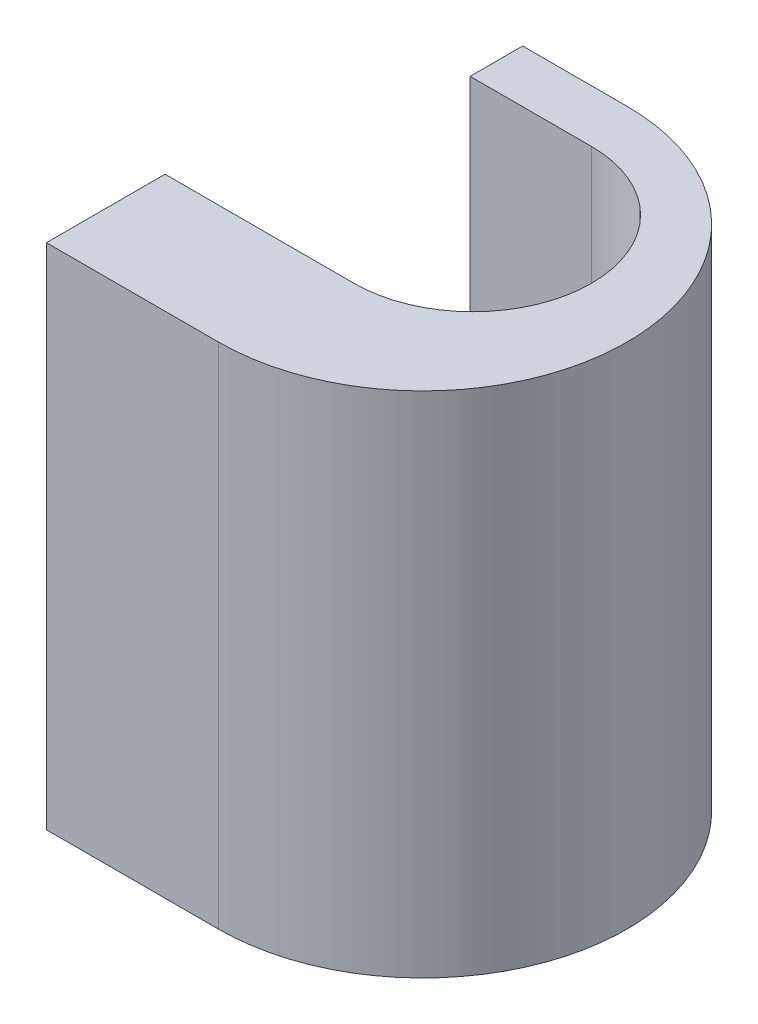
ISO-10303-21;
HEADER;
FILE_DESCRIPTION(('STEP AP214'),'2;1');
FILE_NAME('part.step','',(''),(''),'','','');
FILE_SCHEMA(('AUTOMOTIVE_DESIGN { 1 0 10303 214 1 1 1 1 }'));
ENDSEC;
DATA;
#1=APPLICATION_CONTEXT('core data for automotive mechanical design processes');
#2=APPLICATION_PROTOCOL_DEFINITION('international standard','automotive_design',2000,#1);
#3=PRODUCT_CONTEXT('',#1,'mechanical');
#4=PRODUCT('Part','Part','',(#3));
#5=PRODUCT_RELATED_PRODUCT_CATEGORY('part','',(#4));
#6=PRODUCT_DEFINITION_FORMATION('','',#4);
#7=PRODUCT_DEFINITION_CONTEXT('part definition',#1,'design');
#8=PRODUCT_DEFINITION('design','',#6,#7);
#9=PRODUCT_DEFINITION_SHAPE('','',#8);
#10=(LENGTH_UNIT() NAMED_UNIT(*) SI_UNIT(.MILLI.,.METRE.));
#11=(NAMED_UNIT(*) PLANE_ANGLE_UNIT() SI_UNIT($,.RADIAN.));
#12=(NAMED_UNIT(*) SI_UNIT($,.STERADIAN.) SOLID_ANGLE_UNIT());
#13=UNCERTAINTY_MEASURE_WITH_UNIT(LENGTH_MEASURE(1.E-05),#10,'distance_accuracy_value','');
#14=(GEOMETRIC_REPRESENTATION_CONTEXT(3) GLOBAL_UNCERTAINTY_ASSIGNED_CONTEXT((#13)) GLOBAL_UNIT_ASSIGNED_CONTEXT((#10,
#11,#12)) REPRESENTATION_CONTEXT('',''));
#15=CARTESIAN_POINT('',(0.,0.,0.));
#16=DIRECTION('',(0.,0.,1.));
#17=DIRECTION('',(1.,0.,0.));
#18=AXIS2_PLACEMENT_3D('',#15,#16,#17);
#19=CARTESIAN_POINT('',(0.643666223997992,4.,0.53336368));
#20=DIRECTION('',(0.,-1.,0.));
#21=DIRECTION('',(0.,0.,-1.));
#22=AXIS2_PLACEMENT_3D('',#19,#20,#21);
#23=PLANE('',#22);
#24=DIRECTION('',(0.,0.,1.));
#25=VECTOR('',#24,1.);
#26=CARTESIAN_POINT('',(-2.93579488,4.,0.53336368));
#27=LINE('',#26,#25);
#28=CARTESIAN_POINT('',(-2.93579488,4.,-2.96663632));
#29=VERTEX_POINT('',#28);
#30=CARTESIAN_POINT('',(-2.93579488,4.,4.03336368));
#31=VERTEX_POINT('',#30);
#32=EDGE_CURVE('E55',#29,#31,#27,.T.);
#33=ORIENTED_EDGE('',*,*,#32,.T.);
#34=DIRECTION('',(1.,0.,0.));
#35=VECTOR('',#34,1.);
#36=CARTESIAN_POINT('',(-2.93579488,4.,4.03336368));
#37=LINE('',#36,#35);
#38=CARTESIAN_POINT('',(0.643666223997992,4.,4.03336368));
#39=VERTEX_POINT('',#38);
#40=EDGE_CURVE('E151',#31,#39,#37,.T.);
#41=ORIENTED_EDGE('',*,*,#40,.T.);
#42=CARTESIAN_POINT('',(0.643666223997992,4.,0.53336368));
#43=DIRECTION('',(0.,1.,0.));
#44=DIRECTION('',(0.,0.,-1.));
#45=AXIS2_PLACEMENT_3D('',#42,#43,#44);
#46=CIRCLE('',#45,3.5);
#47=CARTESIAN_POINT('',(0.643666223997992,4.,-2.96663632));
#48=VERTEX_POINT('',#47);
#49=EDGE_CURVE('E62',#39,#48,#46,.T.);
#50=ORIENTED_EDGE('',*,*,#49,.T.);
#51=DIRECTION('',(-1.,0.,0.));
#52=VECTOR('',#51,1.);
#53=CARTESIAN_POINT('',(-2.93579488,4.,-2.96663632));
#54=LINE('',#53,#52);
#55=EDGE_CURVE('E48',#48,#29,#54,.T.);
#56=ORIENTED_EDGE('',*,*,#55,.T.);
#57=EDGE_LOOP('',(#33,#41,#50,#56));
#58=FACE_BOUND('',#57,.T.);
#59=CARTESIAN_POINT('',(0.,4.,0.));
#60=DIRECTION('',(0.,1.,0.));
#61=DIRECTION('',(0.,0.,1.));
#62=AXIS2_PLACEMENT_3D('',#59,#60,#61);
#63=CIRCLE('',#62,1.7);
#64=CARTESIAN_POINT('',(0.,4.,1.7));
#65=VERTEX_POINT('',#64);
#66=EDGE_CURVE('E139',#65,#65,#63,.T.);
#67=ORIENTED_EDGE('',*,*,#66,.F.);
#68=EDGE_LOOP('',(#67));
#69=FACE_BOUND('',#68,.T.);
#70=ADVANCED_FACE('F39',(#58,#69),#23,.F.);
#71=CARTESIAN_POINT('',(0.643666223997992,0.,0.53336368));
#72=DIRECTION('',(0.,-1.,0.));
#73=DIRECTION('',(0.,0.,-1.));
#74=AXIS2_PLACEMENT_3D('',#71,#72,#73);
#75=PLANE('',#74);
#76=DIRECTION('',(-1.,0.,0.));
#77=VECTOR('',#76,1.);
#78=CARTESIAN_POINT('',(-4.93579488,0.,4.03336368));
#79=LINE('',#78,#77);
#80=CARTESIAN_POINT('',(-2.93579488,0.,4.03336368));
#81=VERTEX_POINT('',#80);
#82=CARTESIAN_POINT('',(-4.93579488,0.,4.03336368));
#83=VERTEX_POINT('',#82);
#84=EDGE_CURVE('E168',#81,#83,#79,.T.);
#85=ORIENTED_EDGE('',*,*,#84,.F.);
#86=DIRECTION('',(0.,0.,1.));
#87=VECTOR('',#86,1.);
#88=CARTESIAN_POINT('',(-2.93579488,0.,0.53336368));
#89=LINE('',#88,#87);
#90=CARTESIAN_POINT('',(-2.93579488,0.,-4.51757177830843));
#91=VERTEX_POINT('',#90);
#92=EDGE_CURVE('E147',#91,#81,#89,.T.);
#93=ORIENTED_EDGE('',*,*,#92,.F.);
#94=DIRECTION('',(-1.,0.,0.));
#95=VECTOR('',#94,1.);
#96=CARTESIAN_POINT('',(-2.93579488,0.,-4.51757177830843));
#97=LINE('',#96,#95);
#98=CARTESIAN_POINT('',(0.143666225857322,0.,-4.51757177830843));
#99=VERTEX_POINT('',#98);
#100=EDGE_CURVE('E131',#99,#91,#97,.T.);
#101=ORIENTED_EDGE('',*,*,#100,.F.);
#102=CARTESIAN_POINT('',(0.143666225857322,0.,1.50789595084578));
#103=DIRECTION('',(0.,1.,0.));
#104=DIRECTION('',(0.,0.,-1.));
#105=AXIS2_PLACEMENT_3D('',#102,#103,#104);
#106=CIRCLE('',#105,6.02546772915422);
#107=CARTESIAN_POINT('',(0.143666225857323,0.,7.53336368));
#108=VERTEX_POINT('',#107);
#109=EDGE_CURVE('E185',#108,#99,#106,.T.);
#110=ORIENTED_EDGE('',*,*,#109,.F.);
#111=DIRECTION('',(1.,0.,0.));
#112=VECTOR('',#111,1.);
#113=CARTESIAN_POINT('',(0.143666225857323,0.,7.53336368));
#114=LINE('',#113,#112);
#115=CARTESIAN_POINT('',(-4.93579488,0.,7.53336368));
#116=VERTEX_POINT('',#115);
#117=EDGE_CURVE('E178',#116,#108,#114,.T.);
#118=ORIENTED_EDGE('',*,*,#117,.F.);
#119=DIRECTION('',(0.,0.,1.));
#120=VECTOR('',#119,1.);
#121=CARTESIAN_POINT('',(-4.93579488,0.,7.53336368));
#122=LINE('',#121,#120);
#123=EDGE_CURVE('E174',#83,#116,#122,.T.);
#124=ORIENTED_EDGE('',*,*,#123,.F.);
#125=EDGE_LOOP('',(#85,#93,#101,#110,#118,#124));
#126=FACE_BOUND('',#125,.T.);
#127=CARTESIAN_POINT('',(0.,0.,0.));
#128=DIRECTION('',(0.,1.,0.));
#129=DIRECTION('',(0.,0.,1.));
#130=AXIS2_PLACEMENT_3D('',#127,#128,#129);
#131=CIRCLE('',#130,1.7);
#132=CARTESIAN_POINT('',(0.,0.,1.7));
#133=VERTEX_POINT('',#132);
#134=EDGE_CURVE('E134',#133,#133,#131,.T.);
#135=ORIENTED_EDGE('',*,*,#134,.T.);
#136=EDGE_LOOP('',(#135));
#137=FACE_BOUND('',#136,.T.);
#138=ADVANCED_FACE('F171',(#126,#137),#75,.T.);
#139=CARTESIAN_POINT('',(-2.93579488,4.,0.53336368));
#140=DIRECTION('',(1.,0.,0.));
#141=DIRECTION('',(0.,0.,-1.));
#142=AXIS2_PLACEMENT_3D('',#139,#140,#141);
#143=PLANE('',#142);
#144=ORIENTED_EDGE('',*,*,#92,.T.);
#145=DIRECTION('',(0.,-1.,0.));
#146=VECTOR('',#145,1.);
#147=CARTESIAN_POINT('',(-2.93579488,4.,4.03336368));
#148=LINE('',#147,#146);
#149=EDGE_CURVE('E11',#31,#81,#148,.T.);
#150=ORIENTED_EDGE('',*,*,#149,.F.);
#151=ORIENTED_EDGE('',*,*,#32,.F.);
#152=DIRECTION('',(0.,-1.,0.));
#153=VECTOR('',#152,1.);
#154=CARTESIAN_POINT('',(-2.93579488,15.,-2.96663632));
#155=LINE('',#154,#153);
#156=CARTESIAN_POINT('',(-2.93579488,15.,-2.96663632));
#157=VERTEX_POINT('',#156);
#158=EDGE_CURVE('E115',#157,#29,#155,.T.);
#159=ORIENTED_EDGE('',*,*,#158,.F.);
#160=DIRECTION('',(0.,0.,1.));
#161=VECTOR('',#160,1.);
#162=CARTESIAN_POINT('',(-2.93579488,15.,-4.51757177830843));
#163=LINE('',#162,#161);
#164=CARTESIAN_POINT('',(-2.93579488,15.,-4.51757177830843));
#165=VERTEX_POINT('',#164);
#166=EDGE_CURVE('E122',#165,#157,#163,.T.);
#167=ORIENTED_EDGE('',*,*,#166,.F.);
#168=DIRECTION('',(0.,-1.,0.));
#169=VECTOR('',#168,1.);
#170=CARTESIAN_POINT('',(-2.93579488,15.,-4.51757177830843));
#171=LINE('',#170,#169);
#172=EDGE_CURVE('E159',#165,#91,#171,.T.);
#173=ORIENTED_EDGE('',*,*,#172,.T.);
#174=EDGE_LOOP('',(#144,#150,#151,#159,#167,#173));
#175=FACE_BOUND('',#174,.T.);
#176=ADVANCED_FACE('F41',(#175),#143,.F.);
#177=CARTESIAN_POINT('',(0.,4.,0.));
#178=DIRECTION('',(0.,-1.,0.));
#179=DIRECTION('',(0.,0.,-1.));
#180=AXIS2_PLACEMENT_3D('',#177,#178,#179);
#181=CYLINDRICAL_SURFACE('',#180,1.7);
#182=ORIENTED_EDGE('',*,*,#66,.T.);
#183=EDGE_LOOP('',(#182));
#184=FACE_BOUND('',#183,.T.);
#185=ORIENTED_EDGE('',*,*,#134,.F.);
#186=EDGE_LOOP('',(#185));
#187=FACE_BOUND('',#186,.T.);
#188=ADVANCED_FACE('F255',(#184,#187),#181,.F.);
#189=CARTESIAN_POINT('',(0.643666223997991,15.,0.53336368));
#190=DIRECTION('',(0.,-1.,0.));
#191=DIRECTION('',(0.,0.,-1.));
#192=AXIS2_PLACEMENT_3D('',#189,#190,#191);
#193=CYLINDRICAL_SURFACE('',#192,3.5);
#194=DIRECTION('',(0.,-1.,0.));
#195=VECTOR('',#194,1.);
#196=CARTESIAN_POINT('',(0.643666223997992,15.,-2.96663632));
#197=LINE('',#196,#195);
#198=CARTESIAN_POINT('',(0.643666223997992,15.,-2.96663632));
#199=VERTEX_POINT('',#198);
#200=EDGE_CURVE('E117',#199,#48,#197,.T.);
#201=ORIENTED_EDGE('',*,*,#200,.T.);
#202=ORIENTED_EDGE('',*,*,#49,.F.);
#203=DIRECTION('',(0.,-1.,0.));
#204=VECTOR('',#203,1.);
#205=CARTESIAN_POINT('',(0.643666223997992,15.,4.03336368));
#206=LINE('',#205,#204);
#207=CARTESIAN_POINT('',(0.643666223997992,15.,4.03336368));
#208=VERTEX_POINT('',#207);
#209=EDGE_CURVE('E141',#208,#39,#206,.T.);
#210=ORIENTED_EDGE('',*,*,#209,.F.);
#211=CARTESIAN_POINT('',(0.643666223997991,15.,0.53336368));
#212=DIRECTION('',(0.,-1.,0.));
#213=DIRECTION('',(0.,0.,1.));
#214=AXIS2_PLACEMENT_3D('',#211,#212,#213);
#215=CIRCLE('',#214,3.5);
#216=EDGE_CURVE('E121',#199,#208,#215,.T.);
#217=ORIENTED_EDGE('',*,*,#216,.F.);
#218=EDGE_LOOP('',(#201,#202,#210,#217));
#219=FACE_BOUND('',#218,.T.);
#220=ADVANCED_FACE('F211',(#219),#193,.F.);
#221=CARTESIAN_POINT('',(0.643666223997992,15.,-2.96663632));
#222=DIRECTION('',(0.,0.,-1.));
#223=DIRECTION('',(-1.,0.,0.));
#224=AXIS2_PLACEMENT_3D('',#221,#222,#223);
#225=PLANE('',#224);
#226=ORIENTED_EDGE('',*,*,#158,.T.);
#227=ORIENTED_EDGE('',*,*,#55,.F.);
#228=ORIENTED_EDGE('',*,*,#200,.F.);
#229=DIRECTION('',(1.,0.,0.));
#230=VECTOR('',#229,1.);
#231=CARTESIAN_POINT('',(0.643666223997992,15.,-2.96663632));
#232=LINE('',#231,#230);
#233=EDGE_CURVE('E112',#157,#199,#232,.T.);
#234=ORIENTED_EDGE('',*,*,#233,.F.);
#235=EDGE_LOOP('',(#226,#227,#228,#234));
#236=FACE_BOUND('',#235,.T.);
#237=ADVANCED_FACE('F114',(#236),#225,.F.);
#238=CARTESIAN_POINT('',(-4.93579488,15.,4.03336368));
#239=DIRECTION('',(0.,0.,1.));
#240=DIRECTION('',(1.,0.,0.));
#241=AXIS2_PLACEMENT_3D('',#238,#239,#240);
#242=PLANE('',#241);
#243=ORIENTED_EDGE('',*,*,#209,.T.);
#244=ORIENTED_EDGE('',*,*,#40,.F.);
#245=ORIENTED_EDGE('',*,*,#149,.T.);
#246=ORIENTED_EDGE('',*,*,#84,.T.);
#247=DIRECTION('',(0.,-1.,0.));
#248=VECTOR('',#247,1.);
#249=CARTESIAN_POINT('',(-4.93579488,15.,4.03336368));
#250=LINE('',#249,#248);
#251=CARTESIAN_POINT('',(-4.93579488,15.,4.03336368));
#252=VERTEX_POINT('',#251);
#253=EDGE_CURVE('E204',#252,#83,#250,.T.);
#254=ORIENTED_EDGE('',*,*,#253,.F.);
#255=DIRECTION('',(-1.,0.,0.));
#256=VECTOR('',#255,1.);
#257=CARTESIAN_POINT('',(-2.93579488,15.,4.03336368));
#258=LINE('',#257,#256);
#259=EDGE_CURVE('E209',#208,#252,#258,.T.);
#260=ORIENTED_EDGE('',*,*,#259,.F.);
#261=EDGE_LOOP('',(#243,#244,#245,#246,#254,#260));
#262=FACE_BOUND('',#261,.T.);
#263=ADVANCED_FACE('F166',(#262),#242,.F.);
#264=CARTESIAN_POINT('',(-4.93579488,15.,7.53336368));
#265=DIRECTION('',(1.,0.,0.));
#266=DIRECTION('',(0.,0.,-1.));
#267=AXIS2_PLACEMENT_3D('',#264,#265,#266);
#268=PLANE('',#267);
#269=ORIENTED_EDGE('',*,*,#123,.T.);
#270=DIRECTION('',(0.,-1.,0.));
#271=VECTOR('',#270,1.);
#272=CARTESIAN_POINT('',(-4.93579488,15.,7.53336368));
#273=LINE('',#272,#271);
#274=CARTESIAN_POINT('',(-4.93579488,15.,7.53336368));
#275=VERTEX_POINT('',#274);
#276=EDGE_CURVE('E200',#275,#116,#273,.T.);
#277=ORIENTED_EDGE('',*,*,#276,.F.);
#278=DIRECTION('',(0.,0.,1.));
#279=VECTOR('',#278,1.);
#280=CARTESIAN_POINT('',(-4.93579488,15.,7.53336368));
#281=LINE('',#280,#279);
#282=EDGE_CURVE('E215',#252,#275,#281,.T.);
#283=ORIENTED_EDGE('',*,*,#282,.F.);
#284=ORIENTED_EDGE('',*,*,#253,.T.);
#285=EDGE_LOOP('',(#269,#277,#283,#284));
#286=FACE_BOUND('',#285,.T.);
#287=ADVANCED_FACE('F237',(#286),#268,.F.);
#288=CARTESIAN_POINT('',(0.143666225857323,15.,7.53336368));
#289=DIRECTION('',(0.,0.,-1.));
#290=DIRECTION('',(-1.,0.,0.));
#291=AXIS2_PLACEMENT_3D('',#288,#289,#290);
#292=PLANE('',#291);
#293=ORIENTED_EDGE('',*,*,#117,.T.);
#294=DIRECTION('',(0.,-1.,0.));
#295=VECTOR('',#294,1.);
#296=CARTESIAN_POINT('',(0.143666225857323,15.,7.53336368));
#297=LINE('',#296,#295);
#298=CARTESIAN_POINT('',(0.143666225857323,15.,7.53336368));
#299=VERTEX_POINT('',#298);
#300=EDGE_CURVE('E196',#299,#108,#297,.T.);
#301=ORIENTED_EDGE('',*,*,#300,.F.);
#302=DIRECTION('',(1.,0.,0.));
#303=VECTOR('',#302,1.);
#304=CARTESIAN_POINT('',(-3.43579487814067,15.,7.53336368));
#305=LINE('',#304,#303);
#306=EDGE_CURVE('E220',#275,#299,#305,.T.);
#307=ORIENTED_EDGE('',*,*,#306,.F.);
#308=ORIENTED_EDGE('',*,*,#276,.T.);
#309=EDGE_LOOP('',(#293,#301,#307,#308));
#310=FACE_BOUND('',#309,.T.);
#311=ADVANCED_FACE('F239',(#310),#292,.F.);
#312=CARTESIAN_POINT('',(0.143666225857322,15.,1.50789595084578));
#313=DIRECTION('',(0.,-1.,0.));
#314=DIRECTION('',(0.,0.,-1.));
#315=AXIS2_PLACEMENT_3D('',#312,#313,#314);
#316=CYLINDRICAL_SURFACE('',#315,6.02546772915422);
#317=ORIENTED_EDGE('',*,*,#109,.T.);
#318=DIRECTION('',(0.,-1.,0.));
#319=VECTOR('',#318,1.);
#320=CARTESIAN_POINT('',(0.143666225857322,15.,-4.51757177830843));
#321=LINE('',#320,#319);
#322=CARTESIAN_POINT('',(0.143666225857322,15.,-4.51757177830843));
#323=VERTEX_POINT('',#322);
#324=EDGE_CURVE('E192',#323,#99,#321,.T.);
#325=ORIENTED_EDGE('',*,*,#324,.F.);
#326=CARTESIAN_POINT('',(0.143666225857322,15.,1.50789595084578));
#327=DIRECTION('',(0.,1.,0.));
#328=DIRECTION('',(0.,0.,-1.));
#329=AXIS2_PLACEMENT_3D('',#326,#327,#328);
#330=CIRCLE('',#329,6.02546772915422);
#331=EDGE_CURVE('E222',#299,#323,#330,.T.);
#332=ORIENTED_EDGE('',*,*,#331,.F.);
#333=ORIENTED_EDGE('',*,*,#300,.T.);
#334=EDGE_LOOP('',(#317,#325,#332,#333));
#335=FACE_BOUND('',#334,.T.);
#336=ADVANCED_FACE('F230',(#335),#316,.T.);
#337=CARTESIAN_POINT('',(-2.93579488,15.,-4.51757177830843));
#338=DIRECTION('',(0.,0.,1.));
#339=DIRECTION('',(1.,0.,0.));
#340=AXIS2_PLACEMENT_3D('',#337,#338,#339);
#341=PLANE('',#340);
#342=ORIENTED_EDGE('',*,*,#100,.T.);
#343=ORIENTED_EDGE('',*,*,#172,.F.);
#344=DIRECTION('',(-1.,0.,0.));
#345=VECTOR('',#344,1.);
#346=CARTESIAN_POINT('',(-2.93579488,15.,-4.51757177830843));
#347=LINE('',#346,#345);
#348=EDGE_CURVE('E127',#323,#165,#347,.T.);
#349=ORIENTED_EDGE('',*,*,#348,.F.);
#350=ORIENTED_EDGE('',*,*,#324,.T.);
#351=EDGE_LOOP('',(#342,#343,#349,#350));
#352=FACE_BOUND('',#351,.T.);
#353=ADVANCED_FACE('F233',(#352),#341,.F.);
#354=CARTESIAN_POINT('',(0.643666223997991,15.,0.53336368));
#355=DIRECTION('',(0.,1.,0.));
#356=DIRECTION('',(0.,0.,1.));
#357=AXIS2_PLACEMENT_3D('',#354,#355,#356);
#358=PLANE('',#357);
#359=ORIENTED_EDGE('',*,*,#166,.T.);
#360=ORIENTED_EDGE('',*,*,#233,.T.);
#361=ORIENTED_EDGE('',*,*,#216,.T.);
#362=ORIENTED_EDGE('',*,*,#259,.T.);
#363=ORIENTED_EDGE('',*,*,#282,.T.);
#364=ORIENTED_EDGE('',*,*,#306,.T.);
#365=ORIENTED_EDGE('',*,*,#331,.T.);
#366=ORIENTED_EDGE('',*,*,#348,.T.);
#367=EDGE_LOOP('',(#359,#360,#361,#362,#363,#364,#365,#366));
#368=FACE_BOUND('',#367,.T.);
#369=ADVANCED_FACE('F125',(#368),#358,.T.);
#370=CLOSED_SHELL('',(#70,#138,#176,#188,#220,#237,#263,#287,#311,#336,#353,#369));
#371=MANIFOLD_SOLID_BREP('B2',#370);
#372=ADVANCED_BREP_SHAPE_REPRESENTATION('',(#18,#371),#14);
#373=SHAPE_DEFINITION_REPRESENTATION(#9,#372);
ENDSEC;
END-ISO-10303-21;
